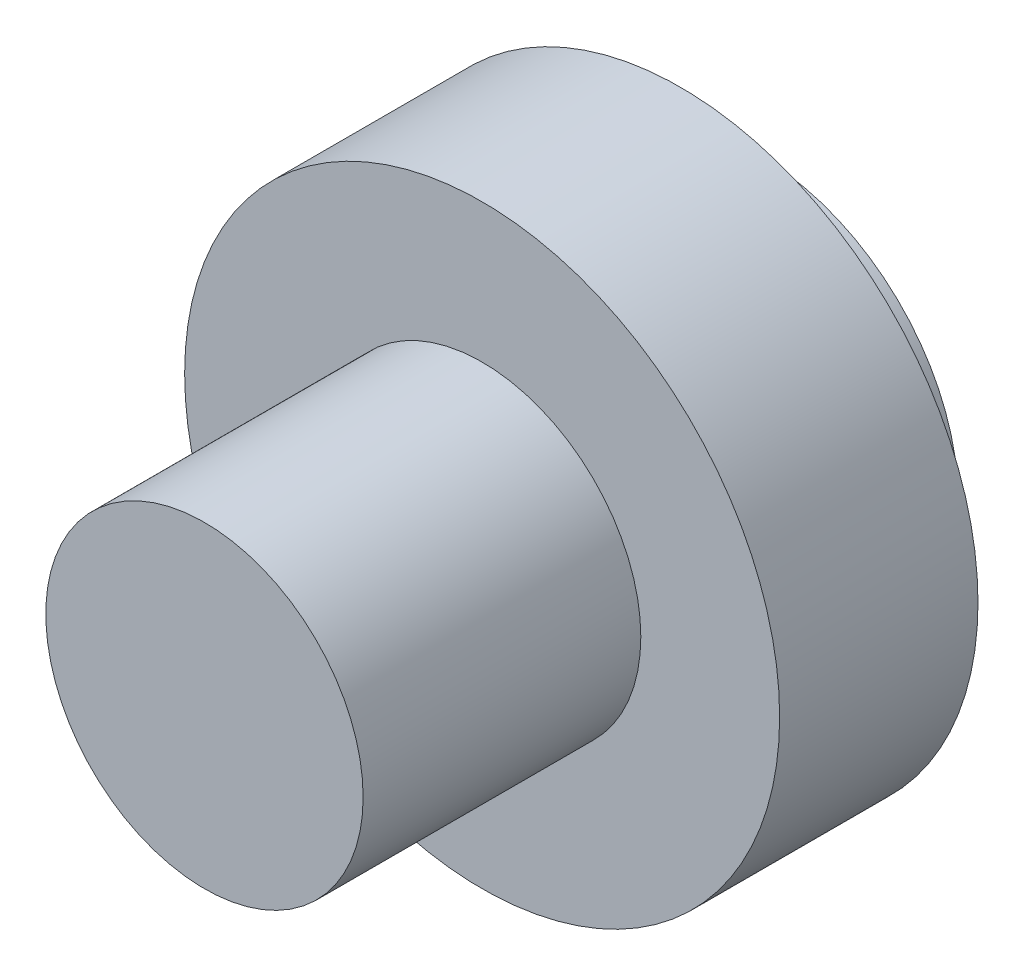
ISO-10303-21;
HEADER;
FILE_DESCRIPTION(('STEP AP214'),'2;1');
FILE_NAME('part.step','',(''),(''),'','','');
FILE_SCHEMA(('AUTOMOTIVE_DESIGN { 1 0 10303 214 1 1 1 1 }'));
ENDSEC;
DATA;
#1=APPLICATION_CONTEXT('core data for automotive mechanical design processes');
#2=APPLICATION_PROTOCOL_DEFINITION('international standard','automotive_design',2000,#1);
#3=PRODUCT_CONTEXT('',#1,'mechanical');
#4=PRODUCT('Part','Part','',(#3));
#5=PRODUCT_RELATED_PRODUCT_CATEGORY('part','',(#4));
#6=PRODUCT_DEFINITION_FORMATION('','',#4);
#7=PRODUCT_DEFINITION_CONTEXT('part definition',#1,'design');
#8=PRODUCT_DEFINITION('design','',#6,#7);
#9=PRODUCT_DEFINITION_SHAPE('','',#8);
#10=(LENGTH_UNIT() NAMED_UNIT(*) SI_UNIT(.MILLI.,.METRE.));
#11=(NAMED_UNIT(*) PLANE_ANGLE_UNIT() SI_UNIT($,.RADIAN.));
#12=(NAMED_UNIT(*) SI_UNIT($,.STERADIAN.) SOLID_ANGLE_UNIT());
#13=UNCERTAINTY_MEASURE_WITH_UNIT(LENGTH_MEASURE(1.E-05),#10,'distance_accuracy_value','');
#14=(GEOMETRIC_REPRESENTATION_CONTEXT(3) GLOBAL_UNCERTAINTY_ASSIGNED_CONTEXT((#13)) GLOBAL_UNIT_ASSIGNED_CONTEXT((#10,
#11,#12)) REPRESENTATION_CONTEXT('',''));
#15=CARTESIAN_POINT('',(0.,0.,0.));
#16=DIRECTION('',(0.,0.,1.));
#17=DIRECTION('',(1.,0.,0.));
#18=AXIS2_PLACEMENT_3D('',#15,#16,#17);
#19=CARTESIAN_POINT('',(0.,0.,7.));
#20=DIRECTION('',(0.,0.,1.));
#21=DIRECTION('',(1.,0.,0.));
#22=AXIS2_PLACEMENT_3D('',#19,#20,#21);
#23=PLANE('',#22);
#24=CARTESIAN_POINT('',(0.,0.,7.));
#25=DIRECTION('',(0.,0.,1.));
#26=DIRECTION('',(1.,0.,0.));
#27=AXIS2_PLACEMENT_3D('',#24,#25,#26);
#28=CIRCLE('',#27,7.5);
#29=CARTESIAN_POINT('',(7.5,0.,7.));
#30=VERTEX_POINT('',#29);
#31=EDGE_CURVE('E44',#30,#30,#28,.T.);
#32=ORIENTED_EDGE('',*,*,#31,.T.);
#33=EDGE_LOOP('',(#32));
#34=FACE_BOUND('',#33,.T.);
#35=CARTESIAN_POINT('',(0.,0.,7.));
#36=DIRECTION('',(0.,0.,1.));
#37=DIRECTION('',(1.,0.,0.));
#38=AXIS2_PLACEMENT_3D('',#35,#36,#37);
#39=CIRCLE('',#38,4.);
#40=CARTESIAN_POINT('',(4.,0.,7.));
#41=VERTEX_POINT('',#40);
#42=EDGE_CURVE('E52',#41,#41,#39,.T.);
#43=ORIENTED_EDGE('',*,*,#42,.F.);
#44=EDGE_LOOP('',(#43));
#45=FACE_BOUND('',#44,.T.);
#46=ADVANCED_FACE('F33',(#34,#45),#23,.T.);
#47=CARTESIAN_POINT('',(0.,0.,2.));
#48=DIRECTION('',(0.,0.,-1.));
#49=DIRECTION('',(-1.,0.,0.));
#50=AXIS2_PLACEMENT_3D('',#47,#48,#49);
#51=CYLINDRICAL_SURFACE('',#50,5.);
#52=CARTESIAN_POINT('',(0.,0.,2.));
#53=DIRECTION('',(0.,0.,1.));
#54=DIRECTION('',(1.,0.,0.));
#55=AXIS2_PLACEMENT_3D('',#52,#53,#54);
#56=CIRCLE('',#55,5.);
#57=CARTESIAN_POINT('',(5.,0.,2.));
#58=VERTEX_POINT('',#57);
#59=EDGE_CURVE('E10',#58,#58,#56,.T.);
#60=ORIENTED_EDGE('',*,*,#59,.F.);
#61=EDGE_LOOP('',(#60));
#62=FACE_BOUND('',#61,.T.);
#63=CARTESIAN_POINT('',(0.,0.,0.));
#64=DIRECTION('',(0.,0.,1.));
#65=DIRECTION('',(1.,0.,0.));
#66=AXIS2_PLACEMENT_3D('',#63,#64,#65);
#67=CIRCLE('',#66,5.);
#68=CARTESIAN_POINT('',(5.,0.,0.));
#69=VERTEX_POINT('',#68);
#70=EDGE_CURVE('E37',#69,#69,#67,.T.);
#71=ORIENTED_EDGE('',*,*,#70,.T.);
#72=EDGE_LOOP('',(#71));
#73=FACE_BOUND('',#72,.T.);
#74=ADVANCED_FACE('F35',(#62,#73),#51,.T.);
#75=CARTESIAN_POINT('',(0.,0.,0.));
#76=DIRECTION('',(0.,0.,1.));
#77=DIRECTION('',(1.,0.,0.));
#78=AXIS2_PLACEMENT_3D('',#75,#76,#77);
#79=PLANE('',#78);
#80=ORIENTED_EDGE('',*,*,#70,.F.);
#81=EDGE_LOOP('',(#80));
#82=FACE_BOUND('',#81,.T.);
#83=ADVANCED_FACE('F73',(#82),#79,.F.);
#84=CARTESIAN_POINT('',(0.,0.,2.));
#85=DIRECTION('',(0.,0.,1.));
#86=DIRECTION('',(1.,0.,0.));
#87=AXIS2_PLACEMENT_3D('',#84,#85,#86);
#88=PLANE('',#87);
#89=CARTESIAN_POINT('',(0.,0.,2.));
#90=DIRECTION('',(0.,0.,1.));
#91=DIRECTION('',(1.,0.,0.));
#92=AXIS2_PLACEMENT_3D('',#89,#90,#91);
#93=CIRCLE('',#92,7.5);
#94=CARTESIAN_POINT('',(7.5,0.,2.));
#95=VERTEX_POINT('',#94);
#96=EDGE_CURVE('E46',#95,#95,#93,.T.);
#97=ORIENTED_EDGE('',*,*,#96,.F.);
#98=EDGE_LOOP('',(#97));
#99=FACE_BOUND('',#98,.T.);
#100=ORIENTED_EDGE('',*,*,#59,.T.);
#101=EDGE_LOOP('',(#100));
#102=FACE_BOUND('',#101,.T.);
#103=ADVANCED_FACE('F77',(#99,#102),#88,.F.);
#104=CARTESIAN_POINT('',(0.,0.,7.));
#105=DIRECTION('',(0.,0.,-1.));
#106=DIRECTION('',(-1.,0.,0.));
#107=AXIS2_PLACEMENT_3D('',#104,#105,#106);
#108=CYLINDRICAL_SURFACE('',#107,7.5);
#109=ORIENTED_EDGE('',*,*,#31,.F.);
#110=EDGE_LOOP('',(#109));
#111=FACE_BOUND('',#110,.T.);
#112=ORIENTED_EDGE('',*,*,#96,.T.);
#113=EDGE_LOOP('',(#112));
#114=FACE_BOUND('',#113,.T.);
#115=ADVANCED_FACE('F63',(#111,#114),#108,.T.);
#116=CARTESIAN_POINT('',(0.,0.,14.));
#117=DIRECTION('',(0.,0.,-1.));
#118=DIRECTION('',(-1.,0.,0.));
#119=AXIS2_PLACEMENT_3D('',#116,#117,#118);
#120=CYLINDRICAL_SURFACE('',#119,4.);
#121=CARTESIAN_POINT('',(0.,0.,14.));
#122=DIRECTION('',(0.,0.,1.));
#123=DIRECTION('',(1.,0.,0.));
#124=AXIS2_PLACEMENT_3D('',#121,#122,#123);
#125=CIRCLE('',#124,4.);
#126=CARTESIAN_POINT('',(4.,0.,14.));
#127=VERTEX_POINT('',#126);
#128=EDGE_CURVE('E49',#127,#127,#125,.T.);
#129=ORIENTED_EDGE('',*,*,#128,.F.);
#130=EDGE_LOOP('',(#129));
#131=FACE_BOUND('',#130,.T.);
#132=ORIENTED_EDGE('',*,*,#42,.T.);
#133=EDGE_LOOP('',(#132));
#134=FACE_BOUND('',#133,.T.);
#135=ADVANCED_FACE('F60',(#131,#134),#120,.T.);
#136=CARTESIAN_POINT('',(0.,0.,14.));
#137=DIRECTION('',(0.,0.,1.));
#138=DIRECTION('',(1.,0.,0.));
#139=AXIS2_PLACEMENT_3D('',#136,#137,#138);
#140=PLANE('',#139);
#141=ORIENTED_EDGE('',*,*,#128,.T.);
#142=EDGE_LOOP('',(#141));
#143=FACE_BOUND('',#142,.T.);
#144=ADVANCED_FACE('F58',(#143),#140,.T.);
#145=CLOSED_SHELL('',(#46,#74,#83,#103,#115,#135,#144));
#146=MANIFOLD_SOLID_BREP('B2',#145);
#147=ADVANCED_BREP_SHAPE_REPRESENTATION('',(#18,#146),#14);
#148=SHAPE_DEFINITION_REPRESENTATION(#9,#147);
ENDSEC;
END-ISO-10303-21;
